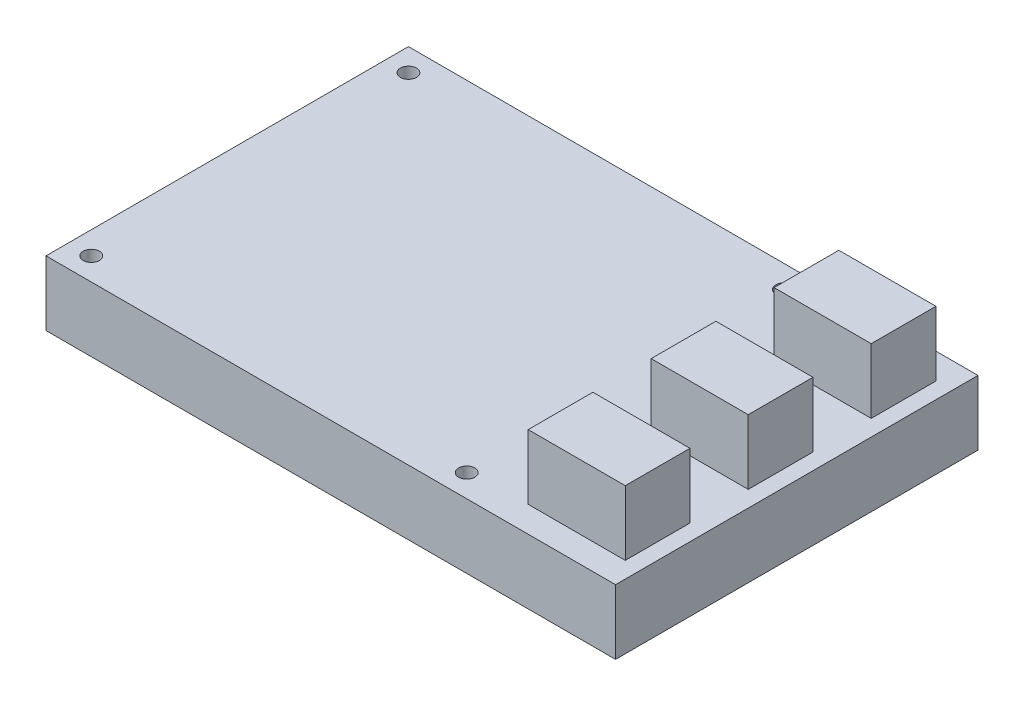
ISO-10303-21;
HEADER;
FILE_DESCRIPTION(('STEP AP214'),'2;1');
FILE_NAME('part.step','',(''),(''),'','','');
FILE_SCHEMA(('AUTOMOTIVE_DESIGN { 1 0 10303 214 1 1 1 1 }'));
ENDSEC;
DATA;
#1=APPLICATION_CONTEXT('core data for automotive mechanical design processes');
#2=APPLICATION_PROTOCOL_DEFINITION('international standard','automotive_design',2000,#1);
#3=PRODUCT_CONTEXT('',#1,'mechanical');
#4=PRODUCT('Part','Part','',(#3));
#5=PRODUCT_RELATED_PRODUCT_CATEGORY('part','',(#4));
#6=PRODUCT_DEFINITION_FORMATION('','',#4);
#7=PRODUCT_DEFINITION_CONTEXT('part definition',#1,'design');
#8=PRODUCT_DEFINITION('design','',#6,#7);
#9=PRODUCT_DEFINITION_SHAPE('','',#8);
#10=(LENGTH_UNIT() NAMED_UNIT(*) SI_UNIT(.MILLI.,.METRE.));
#11=(NAMED_UNIT(*) PLANE_ANGLE_UNIT() SI_UNIT($,.RADIAN.));
#12=(NAMED_UNIT(*) SI_UNIT($,.STERADIAN.) SOLID_ANGLE_UNIT());
#13=UNCERTAINTY_MEASURE_WITH_UNIT(LENGTH_MEASURE(1.E-05),#10,'distance_accuracy_value','');
#14=(GEOMETRIC_REPRESENTATION_CONTEXT(3) GLOBAL_UNCERTAINTY_ASSIGNED_CONTEXT((#13)) GLOBAL_UNIT_ASSIGNED_CONTEXT((#10,
#11,#12)) REPRESENTATION_CONTEXT('',''));
#15=CARTESIAN_POINT('',(0.,0.,0.));
#16=DIRECTION('',(0.,0.,1.));
#17=DIRECTION('',(1.,0.,0.));
#18=AXIS2_PLACEMENT_3D('',#15,#16,#17);
#19=CARTESIAN_POINT('',(0.,10.,0.));
#20=DIRECTION('',(0.,1.,0.));
#21=DIRECTION('',(0.,0.,1.));
#22=AXIS2_PLACEMENT_3D('',#19,#20,#21);
#23=PLANE('',#22);
#24=CARTESIAN_POINT('',(17.5,10.,-24.5));
#25=DIRECTION('',(0.,1.,0.));
#26=DIRECTION('',(0.,0.,1.));
#27=AXIS2_PLACEMENT_3D('',#24,#25,#26);
#28=CIRCLE('',#27,1.25);
#29=CARTESIAN_POINT('',(17.5,10.,-23.25));
#30=VERTEX_POINT('',#29);
#31=EDGE_CURVE('E247',#30,#30,#28,.T.);
#32=ORIENTED_EDGE('',*,*,#31,.F.);
#33=EDGE_LOOP('',(#32));
#34=FACE_BOUND('',#33,.T.);
#35=CARTESIAN_POINT('',(-40.5,10.,24.5));
#36=DIRECTION('',(0.,1.,0.));
#37=DIRECTION('',(0.,0.,1.));
#38=AXIS2_PLACEMENT_3D('',#35,#36,#37);
#39=CIRCLE('',#38,1.25);
#40=CARTESIAN_POINT('',(-40.5,10.,25.75));
#41=VERTEX_POINT('',#40);
#42=EDGE_CURVE('E254',#41,#41,#39,.T.);
#43=ORIENTED_EDGE('',*,*,#42,.F.);
#44=EDGE_LOOP('',(#43));
#45=FACE_BOUND('',#44,.T.);
#46=CARTESIAN_POINT('',(17.5,10.,24.5));
#47=DIRECTION('',(0.,1.,0.));
#48=DIRECTION('',(0.,0.,1.));
#49=AXIS2_PLACEMENT_3D('',#46,#47,#48);
#50=CIRCLE('',#49,1.25);
#51=CARTESIAN_POINT('',(17.5,10.,25.75));
#52=VERTEX_POINT('',#51);
#53=EDGE_CURVE('E241',#52,#52,#50,.T.);
#54=ORIENTED_EDGE('',*,*,#53,.F.);
#55=EDGE_LOOP('',(#54));
#56=FACE_BOUND('',#55,.T.);
#57=CARTESIAN_POINT('',(-40.5,10.,-24.5));
#58=DIRECTION('',(0.,1.,0.));
#59=DIRECTION('',(0.,0.,1.));
#60=AXIS2_PLACEMENT_3D('',#57,#58,#59);
#61=CIRCLE('',#60,1.25);
#62=CARTESIAN_POINT('',(-40.5,10.,-23.25));
#63=VERTEX_POINT('',#62);
#64=EDGE_CURVE('E250',#63,#63,#61,.T.);
#65=ORIENTED_EDGE('',*,*,#64,.F.);
#66=EDGE_LOOP('',(#65));
#67=FACE_BOUND('',#66,.T.);
#68=DIRECTION('',(0.,0.,-1.));
#69=VECTOR('',#68,1.);
#70=CARTESIAN_POINT('',(44.,10.,-28.));
#71=LINE('',#70,#69);
#72=CARTESIAN_POINT('',(44.,10.,28.));
#73=VERTEX_POINT('',#72);
#74=CARTESIAN_POINT('',(44.,10.,-28.));
#75=VERTEX_POINT('',#74);
#76=EDGE_CURVE('E265',#73,#75,#71,.T.);
#77=ORIENTED_EDGE('',*,*,#76,.T.);
#78=DIRECTION('',(-1.,0.,0.));
#79=VECTOR('',#78,1.);
#80=CARTESIAN_POINT('',(-44.,10.,-28.));
#81=LINE('',#80,#79);
#82=CARTESIAN_POINT('',(-44.,10.,-28.));
#83=VERTEX_POINT('',#82);
#84=EDGE_CURVE('E268',#75,#83,#81,.T.);
#85=ORIENTED_EDGE('',*,*,#84,.T.);
#86=DIRECTION('',(0.,0.,1.));
#87=VECTOR('',#86,1.);
#88=CARTESIAN_POINT('',(-44.,10.,-28.));
#89=LINE('',#88,#87);
#90=CARTESIAN_POINT('',(-44.,10.,28.));
#91=VERTEX_POINT('',#90);
#92=EDGE_CURVE('E271',#83,#91,#89,.T.);
#93=ORIENTED_EDGE('',*,*,#92,.T.);
#94=DIRECTION('',(1.,0.,0.));
#95=VECTOR('',#94,1.);
#96=CARTESIAN_POINT('',(-44.,10.,28.));
#97=LINE('',#96,#95);
#98=EDGE_CURVE('E273',#91,#73,#97,.T.);
#99=ORIENTED_EDGE('',*,*,#98,.T.);
#100=EDGE_LOOP('',(#77,#85,#93,#99));
#101=FACE_BOUND('',#100,.T.);
#102=DIRECTION('',(-1.,0.,0.));
#103=VECTOR('',#102,1.);
#104=CARTESIAN_POINT('',(26.5,10.,-24.));
#105=LINE('',#104,#103);
#106=CARTESIAN_POINT('',(41.5,10.,-24.));
#107=VERTEX_POINT('',#106);
#108=CARTESIAN_POINT('',(26.5,10.,-24.));
#109=VERTEX_POINT('',#108);
#110=EDGE_CURVE('E225',#107,#109,#105,.T.);
#111=ORIENTED_EDGE('',*,*,#110,.F.);
#112=DIRECTION('',(0.,0.,-1.));
#113=VECTOR('',#112,1.);
#114=CARTESIAN_POINT('',(41.5,10.,-24.));
#115=LINE('',#114,#113);
#116=CARTESIAN_POINT('',(41.5,10.,-14.));
#117=VERTEX_POINT('',#116);
#118=EDGE_CURVE('E204',#117,#107,#115,.T.);
#119=ORIENTED_EDGE('',*,*,#118,.F.);
#120=DIRECTION('',(1.,0.,0.));
#121=VECTOR('',#120,1.);
#122=CARTESIAN_POINT('',(26.5,10.,-14.));
#123=LINE('',#122,#121);
#124=CARTESIAN_POINT('',(26.5,10.,-14.));
#125=VERTEX_POINT('',#124);
#126=EDGE_CURVE('E216',#125,#117,#123,.T.);
#127=ORIENTED_EDGE('',*,*,#126,.F.);
#128=DIRECTION('',(0.,0.,1.));
#129=VECTOR('',#128,1.);
#130=CARTESIAN_POINT('',(26.5,10.,-24.));
#131=LINE('',#130,#129);
#132=EDGE_CURVE('E227',#109,#125,#131,.T.);
#133=ORIENTED_EDGE('',*,*,#132,.F.);
#134=EDGE_LOOP('',(#111,#119,#127,#133));
#135=FACE_BOUND('',#134,.T.);
#136=DIRECTION('',(-1.,0.,0.));
#137=VECTOR('',#136,1.);
#138=CARTESIAN_POINT('',(26.5,10.,-5.));
#139=LINE('',#138,#137);
#140=CARTESIAN_POINT('',(41.5,10.,-5.));
#141=VERTEX_POINT('',#140);
#142=CARTESIAN_POINT('',(26.5,10.,-5.));
#143=VERTEX_POINT('',#142);
#144=EDGE_CURVE('E199',#141,#143,#139,.T.);
#145=ORIENTED_EDGE('',*,*,#144,.F.);
#146=DIRECTION('',(0.,0.,-1.));
#147=VECTOR('',#146,1.);
#148=CARTESIAN_POINT('',(41.5,10.,-5.));
#149=LINE('',#148,#147);
#150=CARTESIAN_POINT('',(41.5,10.,5.));
#151=VERTEX_POINT('',#150);
#152=EDGE_CURVE('E201',#151,#141,#149,.T.);
#153=ORIENTED_EDGE('',*,*,#152,.F.);
#154=DIRECTION('',(1.,0.,0.));
#155=VECTOR('',#154,1.);
#156=CARTESIAN_POINT('',(26.5,10.,5.));
#157=LINE('',#156,#155);
#158=CARTESIAN_POINT('',(26.5,10.,5.));
#159=VERTEX_POINT('',#158);
#160=EDGE_CURVE('E194',#159,#151,#157,.T.);
#161=ORIENTED_EDGE('',*,*,#160,.F.);
#162=DIRECTION('',(0.,0.,1.));
#163=VECTOR('',#162,1.);
#164=CARTESIAN_POINT('',(26.5,10.,-5.));
#165=LINE('',#164,#163);
#166=EDGE_CURVE('E196',#143,#159,#165,.T.);
#167=ORIENTED_EDGE('',*,*,#166,.F.);
#168=EDGE_LOOP('',(#145,#153,#161,#167));
#169=FACE_BOUND('',#168,.T.);
#170=DIRECTION('',(-1.,0.,0.));
#171=VECTOR('',#170,1.);
#172=CARTESIAN_POINT('',(26.5,10.,14.));
#173=LINE('',#172,#171);
#174=CARTESIAN_POINT('',(41.5,10.,14.));
#175=VERTEX_POINT('',#174);
#176=CARTESIAN_POINT('',(26.5,10.,14.));
#177=VERTEX_POINT('',#176);
#178=EDGE_CURVE('E173',#175,#177,#173,.T.);
#179=ORIENTED_EDGE('',*,*,#178,.F.);
#180=DIRECTION('',(0.,0.,-1.));
#181=VECTOR('',#180,1.);
#182=CARTESIAN_POINT('',(41.5,10.,14.));
#183=LINE('',#182,#181);
#184=CARTESIAN_POINT('',(41.5,10.,24.));
#185=VERTEX_POINT('',#184);
#186=EDGE_CURVE('E168',#185,#175,#183,.T.);
#187=ORIENTED_EDGE('',*,*,#186,.F.);
#188=DIRECTION('',(1.,0.,0.));
#189=VECTOR('',#188,1.);
#190=CARTESIAN_POINT('',(26.5,10.,24.));
#191=LINE('',#190,#189);
#192=CARTESIAN_POINT('',(26.5,10.,24.));
#193=VERTEX_POINT('',#192);
#194=EDGE_CURVE('E153',#193,#185,#191,.T.);
#195=ORIENTED_EDGE('',*,*,#194,.F.);
#196=DIRECTION('',(0.,0.,1.));
#197=VECTOR('',#196,1.);
#198=CARTESIAN_POINT('',(26.5,10.,14.));
#199=LINE('',#198,#197);
#200=EDGE_CURVE('E161',#177,#193,#199,.T.);
#201=ORIENTED_EDGE('',*,*,#200,.F.);
#202=EDGE_LOOP('',(#179,#187,#195,#201));
#203=FACE_BOUND('',#202,.T.);
#204=ADVANCED_FACE('F39',(#34,#45,#56,#67,#101,#135,#169,#203),#23,.T.);
#205=CARTESIAN_POINT('',(44.,10.,-28.));
#206=DIRECTION('',(-1.,0.,0.));
#207=DIRECTION('',(0.,0.,1.));
#208=AXIS2_PLACEMENT_3D('',#205,#206,#207);
#209=PLANE('',#208);
#210=DIRECTION('',(0.,0.,-1.));
#211=VECTOR('',#210,1.);
#212=CARTESIAN_POINT('',(44.,0.,-28.));
#213=LINE('',#212,#211);
#214=CARTESIAN_POINT('',(44.,0.,28.));
#215=VERTEX_POINT('',#214);
#216=CARTESIAN_POINT('',(44.,0.,-28.));
#217=VERTEX_POINT('',#216);
#218=EDGE_CURVE('E262',#215,#217,#213,.T.);
#219=ORIENTED_EDGE('',*,*,#218,.T.);
#220=DIRECTION('',(0.,-1.,0.));
#221=VECTOR('',#220,1.);
#222=CARTESIAN_POINT('',(44.,10.,-28.));
#223=LINE('',#222,#221);
#224=EDGE_CURVE('E11',#75,#217,#223,.T.);
#225=ORIENTED_EDGE('',*,*,#224,.F.);
#226=ORIENTED_EDGE('',*,*,#76,.F.);
#227=DIRECTION('',(0.,-1.,0.));
#228=VECTOR('',#227,1.);
#229=CARTESIAN_POINT('',(44.,10.,28.));
#230=LINE('',#229,#228);
#231=EDGE_CURVE('E275',#73,#215,#230,.T.);
#232=ORIENTED_EDGE('',*,*,#231,.T.);
#233=EDGE_LOOP('',(#219,#225,#226,#232));
#234=FACE_BOUND('',#233,.T.);
#235=ADVANCED_FACE('F41',(#234),#209,.F.);
#236=CARTESIAN_POINT('',(-44.,10.,-28.));
#237=DIRECTION('',(0.,0.,1.));
#238=DIRECTION('',(1.,0.,0.));
#239=AXIS2_PLACEMENT_3D('',#236,#237,#238);
#240=PLANE('',#239);
#241=DIRECTION('',(-1.,0.,0.));
#242=VECTOR('',#241,1.);
#243=CARTESIAN_POINT('',(-44.,0.,-28.));
#244=LINE('',#243,#242);
#245=CARTESIAN_POINT('',(-44.,0.,-28.));
#246=VERTEX_POINT('',#245);
#247=EDGE_CURVE('E278',#217,#246,#244,.T.);
#248=ORIENTED_EDGE('',*,*,#247,.T.);
#249=DIRECTION('',(0.,-1.,0.));
#250=VECTOR('',#249,1.);
#251=CARTESIAN_POINT('',(-44.,10.,-28.));
#252=LINE('',#251,#250);
#253=EDGE_CURVE('E47',#83,#246,#252,.T.);
#254=ORIENTED_EDGE('',*,*,#253,.F.);
#255=ORIENTED_EDGE('',*,*,#84,.F.);
#256=ORIENTED_EDGE('',*,*,#224,.T.);
#257=EDGE_LOOP('',(#248,#254,#255,#256));
#258=FACE_BOUND('',#257,.T.);
#259=ADVANCED_FACE('F308',(#258),#240,.F.);
#260=CARTESIAN_POINT('',(-44.,10.,-28.));
#261=DIRECTION('',(1.,0.,0.));
#262=DIRECTION('',(0.,0.,-1.));
#263=AXIS2_PLACEMENT_3D('',#260,#261,#262);
#264=PLANE('',#263);
#265=DIRECTION('',(0.,0.,1.));
#266=VECTOR('',#265,1.);
#267=CARTESIAN_POINT('',(-44.,0.,-28.));
#268=LINE('',#267,#266);
#269=CARTESIAN_POINT('',(-44.,0.,28.));
#270=VERTEX_POINT('',#269);
#271=EDGE_CURVE('E280',#246,#270,#268,.T.);
#272=ORIENTED_EDGE('',*,*,#271,.T.);
#273=DIRECTION('',(0.,-1.,0.));
#274=VECTOR('',#273,1.);
#275=CARTESIAN_POINT('',(-44.,10.,28.));
#276=LINE('',#275,#274);
#277=EDGE_CURVE('E285',#91,#270,#276,.T.);
#278=ORIENTED_EDGE('',*,*,#277,.F.);
#279=ORIENTED_EDGE('',*,*,#92,.F.);
#280=ORIENTED_EDGE('',*,*,#253,.T.);
#281=EDGE_LOOP('',(#272,#278,#279,#280));
#282=FACE_BOUND('',#281,.T.);
#283=ADVANCED_FACE('F292',(#282),#264,.F.);
#284=CARTESIAN_POINT('',(-44.,10.,28.));
#285=DIRECTION('',(0.,0.,-1.));
#286=DIRECTION('',(-1.,0.,0.));
#287=AXIS2_PLACEMENT_3D('',#284,#285,#286);
#288=PLANE('',#287);
#289=DIRECTION('',(1.,0.,0.));
#290=VECTOR('',#289,1.);
#291=CARTESIAN_POINT('',(-44.,0.,28.));
#292=LINE('',#291,#290);
#293=EDGE_CURVE('E269',#270,#215,#292,.T.);
#294=ORIENTED_EDGE('',*,*,#293,.T.);
#295=ORIENTED_EDGE('',*,*,#231,.F.);
#296=ORIENTED_EDGE('',*,*,#98,.F.);
#297=ORIENTED_EDGE('',*,*,#277,.T.);
#298=EDGE_LOOP('',(#294,#295,#296,#297));
#299=FACE_BOUND('',#298,.T.);
#300=ADVANCED_FACE('F301',(#299),#288,.F.);
#301=CARTESIAN_POINT('',(0.,0.,0.));
#302=DIRECTION('',(0.,1.,0.));
#303=DIRECTION('',(0.,0.,1.));
#304=AXIS2_PLACEMENT_3D('',#301,#302,#303);
#305=PLANE('',#304);
#306=CARTESIAN_POINT('',(17.5,0.,-24.5));
#307=DIRECTION('',(0.,1.,0.));
#308=DIRECTION('',(0.,0.,1.));
#309=AXIS2_PLACEMENT_3D('',#306,#307,#308);
#310=CIRCLE('',#309,1.25);
#311=CARTESIAN_POINT('',(17.5,0.,-23.25));
#312=VERTEX_POINT('',#311);
#313=EDGE_CURVE('E251',#312,#312,#310,.T.);
#314=ORIENTED_EDGE('',*,*,#313,.T.);
#315=EDGE_LOOP('',(#314));
#316=FACE_BOUND('',#315,.T.);
#317=CARTESIAN_POINT('',(-40.5,0.,24.5));
#318=DIRECTION('',(0.,1.,0.));
#319=DIRECTION('',(0.,0.,1.));
#320=AXIS2_PLACEMENT_3D('',#317,#318,#319);
#321=CIRCLE('',#320,1.25);
#322=CARTESIAN_POINT('',(-40.5,0.,25.75));
#323=VERTEX_POINT('',#322);
#324=EDGE_CURVE('E244',#323,#323,#321,.T.);
#325=ORIENTED_EDGE('',*,*,#324,.T.);
#326=EDGE_LOOP('',(#325));
#327=FACE_BOUND('',#326,.T.);
#328=CARTESIAN_POINT('',(17.5,0.,24.5));
#329=DIRECTION('',(0.,1.,0.));
#330=DIRECTION('',(0.,0.,1.));
#331=AXIS2_PLACEMENT_3D('',#328,#329,#330);
#332=CIRCLE('',#331,1.25);
#333=CARTESIAN_POINT('',(17.5,0.,25.75));
#334=VERTEX_POINT('',#333);
#335=EDGE_CURVE('E240',#334,#334,#332,.T.);
#336=ORIENTED_EDGE('',*,*,#335,.T.);
#337=EDGE_LOOP('',(#336));
#338=FACE_BOUND('',#337,.T.);
#339=CARTESIAN_POINT('',(-40.5,0.,-24.5));
#340=DIRECTION('',(0.,1.,0.));
#341=DIRECTION('',(0.,0.,1.));
#342=AXIS2_PLACEMENT_3D('',#339,#340,#341);
#343=CIRCLE('',#342,1.25);
#344=CARTESIAN_POINT('',(-40.5,0.,-23.25));
#345=VERTEX_POINT('',#344);
#346=EDGE_CURVE('E259',#345,#345,#343,.T.);
#347=ORIENTED_EDGE('',*,*,#346,.T.);
#348=EDGE_LOOP('',(#347));
#349=FACE_BOUND('',#348,.T.);
#350=ORIENTED_EDGE('',*,*,#218,.F.);
#351=ORIENTED_EDGE('',*,*,#293,.F.);
#352=ORIENTED_EDGE('',*,*,#271,.F.);
#353=ORIENTED_EDGE('',*,*,#247,.F.);
#354=EDGE_LOOP('',(#350,#351,#352,#353));
#355=FACE_BOUND('',#354,.T.);
#356=ADVANCED_FACE('F298',(#316,#327,#338,#349,#355),#305,.F.);
#357=CARTESIAN_POINT('',(-40.5,0.,-24.5));
#358=DIRECTION('',(0.,1.,0.));
#359=DIRECTION('',(0.,0.,1.));
#360=AXIS2_PLACEMENT_3D('',#357,#358,#359);
#361=CYLINDRICAL_SURFACE('',#360,1.25);
#362=ORIENTED_EDGE('',*,*,#346,.F.);
#363=EDGE_LOOP('',(#362));
#364=FACE_BOUND('',#363,.T.);
#365=ORIENTED_EDGE('',*,*,#64,.T.);
#366=EDGE_LOOP('',(#365));
#367=FACE_BOUND('',#366,.T.);
#368=ADVANCED_FACE('F326',(#364,#367),#361,.F.);
#369=CARTESIAN_POINT('',(17.5,0.,24.5));
#370=DIRECTION('',(0.,1.,0.));
#371=DIRECTION('',(0.,0.,1.));
#372=AXIS2_PLACEMENT_3D('',#369,#370,#371);
#373=CYLINDRICAL_SURFACE('',#372,1.25);
#374=ORIENTED_EDGE('',*,*,#335,.F.);
#375=EDGE_LOOP('',(#374));
#376=FACE_BOUND('',#375,.T.);
#377=ORIENTED_EDGE('',*,*,#53,.T.);
#378=EDGE_LOOP('',(#377));
#379=FACE_BOUND('',#378,.T.);
#380=ADVANCED_FACE('F348',(#376,#379),#373,.F.);
#381=CARTESIAN_POINT('',(-40.5,0.,24.5));
#382=DIRECTION('',(0.,1.,0.));
#383=DIRECTION('',(0.,0.,1.));
#384=AXIS2_PLACEMENT_3D('',#381,#382,#383);
#385=CYLINDRICAL_SURFACE('',#384,1.25);
#386=ORIENTED_EDGE('',*,*,#324,.F.);
#387=EDGE_LOOP('',(#386));
#388=FACE_BOUND('',#387,.T.);
#389=ORIENTED_EDGE('',*,*,#42,.T.);
#390=EDGE_LOOP('',(#389));
#391=FACE_BOUND('',#390,.T.);
#392=ADVANCED_FACE('F356',(#388,#391),#385,.F.);
#393=CARTESIAN_POINT('',(17.5,0.,-24.5));
#394=DIRECTION('',(0.,1.,0.));
#395=DIRECTION('',(0.,0.,1.));
#396=AXIS2_PLACEMENT_3D('',#393,#394,#395);
#397=CYLINDRICAL_SURFACE('',#396,1.25);
#398=ORIENTED_EDGE('',*,*,#313,.F.);
#399=EDGE_LOOP('',(#398));
#400=FACE_BOUND('',#399,.T.);
#401=ORIENTED_EDGE('',*,*,#31,.T.);
#402=EDGE_LOOP('',(#401));
#403=FACE_BOUND('',#402,.T.);
#404=ADVANCED_FACE('F364',(#400,#403),#397,.F.);
#405=CARTESIAN_POINT('',(41.5,20.,-24.));
#406=DIRECTION('',(-1.,0.,0.));
#407=DIRECTION('',(0.,0.,1.));
#408=AXIS2_PLACEMENT_3D('',#405,#406,#407);
#409=PLANE('',#408);
#410=ORIENTED_EDGE('',*,*,#118,.T.);
#411=DIRECTION('',(0.,-1.,0.));
#412=VECTOR('',#411,1.);
#413=CARTESIAN_POINT('',(41.5,20.,-24.));
#414=LINE('',#413,#412);
#415=CARTESIAN_POINT('',(41.5,20.,-24.));
#416=VERTEX_POINT('',#415);
#417=EDGE_CURVE('E238',#416,#107,#414,.T.);
#418=ORIENTED_EDGE('',*,*,#417,.F.);
#419=DIRECTION('',(0.,0.,-1.));
#420=VECTOR('',#419,1.);
#421=CARTESIAN_POINT('',(41.5,20.,-24.));
#422=LINE('',#421,#420);
#423=CARTESIAN_POINT('',(41.5,20.,-14.));
#424=VERTEX_POINT('',#423);
#425=EDGE_CURVE('E212',#424,#416,#422,.T.);
#426=ORIENTED_EDGE('',*,*,#425,.F.);
#427=DIRECTION('',(0.,-1.,0.));
#428=VECTOR('',#427,1.);
#429=CARTESIAN_POINT('',(41.5,20.,-14.));
#430=LINE('',#429,#428);
#431=EDGE_CURVE('E222',#424,#117,#430,.T.);
#432=ORIENTED_EDGE('',*,*,#431,.T.);
#433=EDGE_LOOP('',(#410,#418,#426,#432));
#434=FACE_BOUND('',#433,.T.);
#435=ADVANCED_FACE('F371',(#434),#409,.F.);
#436=CARTESIAN_POINT('',(26.5,20.,-24.));
#437=DIRECTION('',(0.,0.,1.));
#438=DIRECTION('',(1.,0.,0.));
#439=AXIS2_PLACEMENT_3D('',#436,#437,#438);
#440=PLANE('',#439);
#441=ORIENTED_EDGE('',*,*,#110,.T.);
#442=DIRECTION('',(0.,-1.,0.));
#443=VECTOR('',#442,1.);
#444=CARTESIAN_POINT('',(26.5,20.,-24.));
#445=LINE('',#444,#443);
#446=CARTESIAN_POINT('',(26.5,20.,-24.));
#447=VERTEX_POINT('',#446);
#448=EDGE_CURVE('E235',#447,#109,#445,.T.);
#449=ORIENTED_EDGE('',*,*,#448,.F.);
#450=DIRECTION('',(-1.,0.,0.));
#451=VECTOR('',#450,1.);
#452=CARTESIAN_POINT('',(26.5,20.,-24.));
#453=LINE('',#452,#451);
#454=EDGE_CURVE('E215',#416,#447,#453,.T.);
#455=ORIENTED_EDGE('',*,*,#454,.F.);
#456=ORIENTED_EDGE('',*,*,#417,.T.);
#457=EDGE_LOOP('',(#441,#449,#455,#456));
#458=FACE_BOUND('',#457,.T.);
#459=ADVANCED_FACE('F387',(#458),#440,.F.);
#460=CARTESIAN_POINT('',(26.5,20.,-24.));
#461=DIRECTION('',(1.,0.,0.));
#462=DIRECTION('',(0.,0.,-1.));
#463=AXIS2_PLACEMENT_3D('',#460,#461,#462);
#464=PLANE('',#463);
#465=ORIENTED_EDGE('',*,*,#132,.T.);
#466=DIRECTION('',(0.,-1.,0.));
#467=VECTOR('',#466,1.);
#468=CARTESIAN_POINT('',(26.5,20.,-14.));
#469=LINE('',#468,#467);
#470=CARTESIAN_POINT('',(26.5,20.,-14.));
#471=VERTEX_POINT('',#470);
#472=EDGE_CURVE('E233',#471,#125,#469,.T.);
#473=ORIENTED_EDGE('',*,*,#472,.F.);
#474=DIRECTION('',(0.,0.,1.));
#475=VECTOR('',#474,1.);
#476=CARTESIAN_POINT('',(26.5,20.,-24.));
#477=LINE('',#476,#475);
#478=EDGE_CURVE('E218',#447,#471,#477,.T.);
#479=ORIENTED_EDGE('',*,*,#478,.F.);
#480=ORIENTED_EDGE('',*,*,#448,.T.);
#481=EDGE_LOOP('',(#465,#473,#479,#480));
#482=FACE_BOUND('',#481,.T.);
#483=ADVANCED_FACE('F397',(#482),#464,.F.);
#484=CARTESIAN_POINT('',(26.5,20.,-14.));
#485=DIRECTION('',(0.,0.,-1.));
#486=DIRECTION('',(-1.,0.,0.));
#487=AXIS2_PLACEMENT_3D('',#484,#485,#486);
#488=PLANE('',#487);
#489=ORIENTED_EDGE('',*,*,#126,.T.);
#490=ORIENTED_EDGE('',*,*,#431,.F.);
#491=DIRECTION('',(1.,0.,0.));
#492=VECTOR('',#491,1.);
#493=CARTESIAN_POINT('',(26.5,20.,-14.));
#494=LINE('',#493,#492);
#495=EDGE_CURVE('E220',#471,#424,#494,.T.);
#496=ORIENTED_EDGE('',*,*,#495,.F.);
#497=ORIENTED_EDGE('',*,*,#472,.T.);
#498=EDGE_LOOP('',(#489,#490,#496,#497));
#499=FACE_BOUND('',#498,.T.);
#500=ADVANCED_FACE('F407',(#499),#488,.F.);
#501=CARTESIAN_POINT('',(0.,20.,0.));
#502=DIRECTION('',(0.,1.,0.));
#503=DIRECTION('',(0.,0.,1.));
#504=AXIS2_PLACEMENT_3D('',#501,#502,#503);
#505=PLANE('',#504);
#506=ORIENTED_EDGE('',*,*,#425,.T.);
#507=ORIENTED_EDGE('',*,*,#454,.T.);
#508=ORIENTED_EDGE('',*,*,#478,.T.);
#509=ORIENTED_EDGE('',*,*,#495,.T.);
#510=EDGE_LOOP('',(#506,#507,#508,#509));
#511=FACE_BOUND('',#510,.T.);
#512=ADVANCED_FACE('F417',(#511),#505,.T.);
#513=CARTESIAN_POINT('',(41.5,20.,-5.));
#514=DIRECTION('',(-1.,0.,0.));
#515=DIRECTION('',(0.,0.,1.));
#516=AXIS2_PLACEMENT_3D('',#513,#514,#515);
#517=PLANE('',#516);
#518=ORIENTED_EDGE('',*,*,#152,.T.);
#519=DIRECTION('',(0.,-1.,0.));
#520=VECTOR('',#519,1.);
#521=CARTESIAN_POINT('',(41.5,20.,-5.));
#522=LINE('',#521,#520);
#523=CARTESIAN_POINT('',(41.5,20.,-5.));
#524=VERTEX_POINT('',#523);
#525=EDGE_CURVE('E174',#524,#141,#522,.T.);
#526=ORIENTED_EDGE('',*,*,#525,.F.);
#527=DIRECTION('',(0.,0.,-1.));
#528=VECTOR('',#527,1.);
#529=CARTESIAN_POINT('',(41.5,20.,-5.));
#530=LINE('',#529,#528);
#531=CARTESIAN_POINT('',(41.5,20.,5.));
#532=VERTEX_POINT('',#531);
#533=EDGE_CURVE('E197',#532,#524,#530,.T.);
#534=ORIENTED_EDGE('',*,*,#533,.F.);
#535=DIRECTION('',(0.,-1.,0.));
#536=VECTOR('',#535,1.);
#537=CARTESIAN_POINT('',(41.5,20.,5.));
#538=LINE('',#537,#536);
#539=EDGE_CURVE('E190',#532,#151,#538,.T.);
#540=ORIENTED_EDGE('',*,*,#539,.T.);
#541=EDGE_LOOP('',(#518,#526,#534,#540));
#542=FACE_BOUND('',#541,.T.);
#543=ADVANCED_FACE('F427',(#542),#517,.F.);
#544=CARTESIAN_POINT('',(26.5,20.,-5.));
#545=DIRECTION('',(0.,0.,1.));
#546=DIRECTION('',(1.,0.,0.));
#547=AXIS2_PLACEMENT_3D('',#544,#545,#546);
#548=PLANE('',#547);
#549=ORIENTED_EDGE('',*,*,#144,.T.);
#550=DIRECTION('',(0.,-1.,0.));
#551=VECTOR('',#550,1.);
#552=CARTESIAN_POINT('',(26.5,20.,-5.));
#553=LINE('',#552,#551);
#554=CARTESIAN_POINT('',(26.5,20.,-5.));
#555=VERTEX_POINT('',#554);
#556=EDGE_CURVE('E176',#555,#143,#553,.T.);
#557=ORIENTED_EDGE('',*,*,#556,.F.);
#558=DIRECTION('',(-1.,0.,0.));
#559=VECTOR('',#558,1.);
#560=CARTESIAN_POINT('',(26.5,20.,-5.));
#561=LINE('',#560,#559);
#562=EDGE_CURVE('E208',#524,#555,#561,.T.);
#563=ORIENTED_EDGE('',*,*,#562,.F.);
#564=ORIENTED_EDGE('',*,*,#525,.T.);
#565=EDGE_LOOP('',(#549,#557,#563,#564));
#566=FACE_BOUND('',#565,.T.);
#567=ADVANCED_FACE('F437',(#566),#548,.F.);
#568=CARTESIAN_POINT('',(26.5,20.,-5.));
#569=DIRECTION('',(1.,0.,0.));
#570=DIRECTION('',(0.,0.,-1.));
#571=AXIS2_PLACEMENT_3D('',#568,#569,#570);
#572=PLANE('',#571);
#573=ORIENTED_EDGE('',*,*,#166,.T.);
#574=DIRECTION('',(0.,-1.,0.));
#575=VECTOR('',#574,1.);
#576=CARTESIAN_POINT('',(26.5,20.,5.));
#577=LINE('',#576,#575);
#578=CARTESIAN_POINT('',(26.5,20.,5.));
#579=VERTEX_POINT('',#578);
#580=EDGE_CURVE('E62',#579,#159,#577,.T.);
#581=ORIENTED_EDGE('',*,*,#580,.F.);
#582=DIRECTION('',(0.,0.,1.));
#583=VECTOR('',#582,1.);
#584=CARTESIAN_POINT('',(26.5,20.,-5.));
#585=LINE('',#584,#583);
#586=EDGE_CURVE('E206',#555,#579,#585,.T.);
#587=ORIENTED_EDGE('',*,*,#586,.F.);
#588=ORIENTED_EDGE('',*,*,#556,.T.);
#589=EDGE_LOOP('',(#573,#581,#587,#588));
#590=FACE_BOUND('',#589,.T.);
#591=ADVANCED_FACE('F447',(#590),#572,.F.);
#592=CARTESIAN_POINT('',(26.5,20.,5.));
#593=DIRECTION('',(0.,0.,-1.));
#594=DIRECTION('',(-1.,0.,0.));
#595=AXIS2_PLACEMENT_3D('',#592,#593,#594);
#596=PLANE('',#595);
#597=ORIENTED_EDGE('',*,*,#160,.T.);
#598=ORIENTED_EDGE('',*,*,#539,.F.);
#599=DIRECTION('',(1.,0.,0.));
#600=VECTOR('',#599,1.);
#601=CARTESIAN_POINT('',(26.5,20.,5.));
#602=LINE('',#601,#600);
#603=EDGE_CURVE('E193',#579,#532,#602,.T.);
#604=ORIENTED_EDGE('',*,*,#603,.F.);
#605=ORIENTED_EDGE('',*,*,#580,.T.);
#606=EDGE_LOOP('',(#597,#598,#604,#605));
#607=FACE_BOUND('',#606,.T.);
#608=ADVANCED_FACE('F457',(#607),#596,.F.);
#609=CARTESIAN_POINT('',(0.,20.,0.));
#610=DIRECTION('',(0.,1.,0.));
#611=DIRECTION('',(0.,0.,1.));
#612=AXIS2_PLACEMENT_3D('',#609,#610,#611);
#613=PLANE('',#612);
#614=ORIENTED_EDGE('',*,*,#533,.T.);
#615=ORIENTED_EDGE('',*,*,#562,.T.);
#616=ORIENTED_EDGE('',*,*,#586,.T.);
#617=ORIENTED_EDGE('',*,*,#603,.T.);
#618=EDGE_LOOP('',(#614,#615,#616,#617));
#619=FACE_BOUND('',#618,.T.);
#620=ADVANCED_FACE('F467',(#619),#613,.T.);
#621=CARTESIAN_POINT('',(41.5,20.,14.));
#622=DIRECTION('',(-1.,0.,0.));
#623=DIRECTION('',(0.,0.,1.));
#624=AXIS2_PLACEMENT_3D('',#621,#622,#623);
#625=PLANE('',#624);
#626=ORIENTED_EDGE('',*,*,#186,.T.);
#627=DIRECTION('',(0.,-1.,0.));
#628=VECTOR('',#627,1.);
#629=CARTESIAN_POINT('',(41.5,20.,14.));
#630=LINE('',#629,#628);
#631=CARTESIAN_POINT('',(41.5,20.,14.));
#632=VERTEX_POINT('',#631);
#633=EDGE_CURVE('E526',#632,#175,#630,.T.);
#634=ORIENTED_EDGE('',*,*,#633,.F.);
#635=DIRECTION('',(0.,0.,-1.));
#636=VECTOR('',#635,1.);
#637=CARTESIAN_POINT('',(41.5,20.,14.));
#638=LINE('',#637,#636);
#639=CARTESIAN_POINT('',(41.5,20.,24.));
#640=VERTEX_POINT('',#639);
#641=EDGE_CURVE('E162',#640,#632,#638,.T.);
#642=ORIENTED_EDGE('',*,*,#641,.F.);
#643=DIRECTION('',(0.,-1.,0.));
#644=VECTOR('',#643,1.);
#645=CARTESIAN_POINT('',(41.5,20.,24.));
#646=LINE('',#645,#644);
#647=EDGE_CURVE('E156',#640,#185,#646,.T.);
#648=ORIENTED_EDGE('',*,*,#647,.T.);
#649=EDGE_LOOP('',(#626,#634,#642,#648));
#650=FACE_BOUND('',#649,.T.);
#651=ADVANCED_FACE('F166',(#650),#625,.F.);
#652=CARTESIAN_POINT('',(26.5,20.,14.));
#653=DIRECTION('',(0.,0.,1.));
#654=DIRECTION('',(1.,0.,0.));
#655=AXIS2_PLACEMENT_3D('',#652,#653,#654);
#656=PLANE('',#655);
#657=ORIENTED_EDGE('',*,*,#178,.T.);
#658=DIRECTION('',(0.,-1.,0.));
#659=VECTOR('',#658,1.);
#660=CARTESIAN_POINT('',(26.5,20.,14.));
#661=LINE('',#660,#659);
#662=CARTESIAN_POINT('',(26.5,20.,14.));
#663=VERTEX_POINT('',#662);
#664=EDGE_CURVE('E527',#663,#177,#661,.T.);
#665=ORIENTED_EDGE('',*,*,#664,.F.);
#666=DIRECTION('',(-1.,0.,0.));
#667=VECTOR('',#666,1.);
#668=CARTESIAN_POINT('',(26.5,20.,14.));
#669=LINE('',#668,#667);
#670=EDGE_CURVE('E184',#632,#663,#669,.T.);
#671=ORIENTED_EDGE('',*,*,#670,.F.);
#672=ORIENTED_EDGE('',*,*,#633,.T.);
#673=EDGE_LOOP('',(#657,#665,#671,#672));
#674=FACE_BOUND('',#673,.T.);
#675=ADVANCED_FACE('F485',(#674),#656,.F.);
#676=CARTESIAN_POINT('',(26.5,20.,14.));
#677=DIRECTION('',(1.,0.,0.));
#678=DIRECTION('',(0.,0.,-1.));
#679=AXIS2_PLACEMENT_3D('',#676,#677,#678);
#680=PLANE('',#679);
#681=ORIENTED_EDGE('',*,*,#200,.T.);
#682=DIRECTION('',(0.,-1.,0.));
#683=VECTOR('',#682,1.);
#684=CARTESIAN_POINT('',(26.5,20.,24.));
#685=LINE('',#684,#683);
#686=CARTESIAN_POINT('',(26.5,20.,24.));
#687=VERTEX_POINT('',#686);
#688=EDGE_CURVE('E54',#687,#193,#685,.T.);
#689=ORIENTED_EDGE('',*,*,#688,.F.);
#690=DIRECTION('',(0.,0.,1.));
#691=VECTOR('',#690,1.);
#692=CARTESIAN_POINT('',(26.5,20.,14.));
#693=LINE('',#692,#691);
#694=EDGE_CURVE('E182',#663,#687,#693,.T.);
#695=ORIENTED_EDGE('',*,*,#694,.F.);
#696=ORIENTED_EDGE('',*,*,#664,.T.);
#697=EDGE_LOOP('',(#681,#689,#695,#696));
#698=FACE_BOUND('',#697,.T.);
#699=ADVANCED_FACE('F494',(#698),#680,.F.);
#700=CARTESIAN_POINT('',(26.5,20.,24.));
#701=DIRECTION('',(0.,0.,-1.));
#702=DIRECTION('',(-1.,0.,0.));
#703=AXIS2_PLACEMENT_3D('',#700,#701,#702);
#704=PLANE('',#703);
#705=ORIENTED_EDGE('',*,*,#194,.T.);
#706=ORIENTED_EDGE('',*,*,#647,.F.);
#707=DIRECTION('',(1.,0.,0.));
#708=VECTOR('',#707,1.);
#709=CARTESIAN_POINT('',(26.5,20.,24.));
#710=LINE('',#709,#708);
#711=EDGE_CURVE('E171',#687,#640,#710,.T.);
#712=ORIENTED_EDGE('',*,*,#711,.F.);
#713=ORIENTED_EDGE('',*,*,#688,.T.);
#714=EDGE_LOOP('',(#705,#706,#712,#713));
#715=FACE_BOUND('',#714,.T.);
#716=ADVANCED_FACE('F155',(#715),#704,.F.);
#717=CARTESIAN_POINT('',(0.,20.,0.));
#718=DIRECTION('',(0.,1.,0.));
#719=DIRECTION('',(0.,0.,1.));
#720=AXIS2_PLACEMENT_3D('',#717,#718,#719);
#721=PLANE('',#720);
#722=ORIENTED_EDGE('',*,*,#641,.T.);
#723=ORIENTED_EDGE('',*,*,#670,.T.);
#724=ORIENTED_EDGE('',*,*,#694,.T.);
#725=ORIENTED_EDGE('',*,*,#711,.T.);
#726=EDGE_LOOP('',(#722,#723,#724,#725));
#727=FACE_BOUND('',#726,.T.);
#728=ADVANCED_FACE('F513',(#727),#721,.T.);
#729=CLOSED_SHELL('',(#204,#235,#259,#283,#300,#356,#368,#380,#392,#404,#435,#459,#483,#500,
#512,#543,#567,#591,#608,#620,#651,#675,#699,#716,#728));
#730=MANIFOLD_SOLID_BREP('B2',#729);
#731=ADVANCED_BREP_SHAPE_REPRESENTATION('',(#18,#730),#14);
#732=SHAPE_DEFINITION_REPRESENTATION(#9,#731);
ENDSEC;
END-ISO-10303-21;
